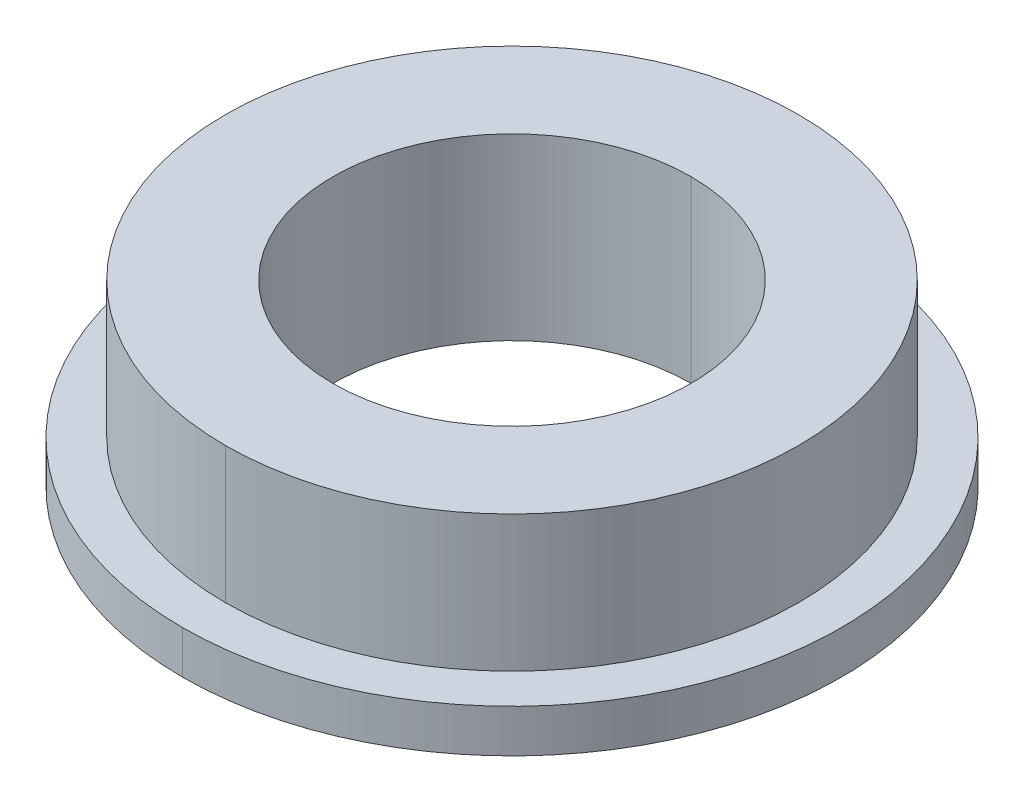
ISO-10303-21;
HEADER;
FILE_DESCRIPTION(('STEP AP214'),'2;1');
FILE_NAME('part.step','',(''),(''),'','','');
FILE_SCHEMA(('AUTOMOTIVE_DESIGN { 1 0 10303 214 1 1 1 1 }'));
ENDSEC;
DATA;
#1=APPLICATION_CONTEXT('core data for automotive mechanical design processes');
#2=APPLICATION_PROTOCOL_DEFINITION('international standard','automotive_design',2000,#1);
#3=PRODUCT_CONTEXT('',#1,'mechanical');
#4=PRODUCT('Part','Part','',(#3));
#5=PRODUCT_RELATED_PRODUCT_CATEGORY('part','',(#4));
#6=PRODUCT_DEFINITION_FORMATION('','',#4);
#7=PRODUCT_DEFINITION_CONTEXT('part definition',#1,'design');
#8=PRODUCT_DEFINITION('design','',#6,#7);
#9=PRODUCT_DEFINITION_SHAPE('','',#8);
#10=(LENGTH_UNIT() NAMED_UNIT(*) SI_UNIT(.MILLI.,.METRE.));
#11=(NAMED_UNIT(*) PLANE_ANGLE_UNIT() SI_UNIT($,.RADIAN.));
#12=(NAMED_UNIT(*) SI_UNIT($,.STERADIAN.) SOLID_ANGLE_UNIT());
#13=UNCERTAINTY_MEASURE_WITH_UNIT(LENGTH_MEASURE(1.E-05),#10,'distance_accuracy_value','');
#14=(GEOMETRIC_REPRESENTATION_CONTEXT(3) GLOBAL_UNCERTAINTY_ASSIGNED_CONTEXT((#13)) GLOBAL_UNIT_ASSIGNED_CONTEXT((#10,
#11,#12)) REPRESENTATION_CONTEXT('',''));
#15=CARTESIAN_POINT('',(0.,0.,0.));
#16=DIRECTION('',(0.,0.,1.));
#17=DIRECTION('',(1.,0.,0.));
#18=AXIS2_PLACEMENT_3D('',#15,#16,#17);
#19=CARTESIAN_POINT('',(0.,0.6,0.));
#20=DIRECTION('',(0.,-1.,0.));
#21=DIRECTION('',(0.,0.,-1.));
#22=AXIS2_PLACEMENT_3D('',#19,#20,#21);
#23=CYLINDRICAL_SURFACE('',#22,4.6);
#24=DIRECTION('',(0.,-1.,0.));
#25=VECTOR('',#24,1.);
#26=CARTESIAN_POINT('',(0.,0.6,4.6));
#27=LINE('',#26,#25);
#28=CARTESIAN_POINT('',(0.,0.6,4.6));
#29=VERTEX_POINT('',#28);
#30=CARTESIAN_POINT('',(0.,0.,4.6));
#31=VERTEX_POINT('',#30);
#32=EDGE_CURVE('E99',#29,#31,#27,.T.);
#33=ORIENTED_EDGE('',*,*,#32,.F.);
#34=CARTESIAN_POINT('',(0.,0.6,0.));
#35=DIRECTION('',(0.,1.,0.));
#36=DIRECTION('',(0.,0.,1.));
#37=AXIS2_PLACEMENT_3D('',#34,#35,#36);
#38=CIRCLE('',#37,4.6);
#39=CARTESIAN_POINT('',(0.,0.6,-4.6));
#40=VERTEX_POINT('',#39);
#41=EDGE_CURVE('E11',#40,#29,#38,.T.);
#42=ORIENTED_EDGE('',*,*,#41,.F.);
#43=DIRECTION('',(0.,-1.,0.));
#44=VECTOR('',#43,1.);
#45=CARTESIAN_POINT('',(0.,0.6,-4.6));
#46=LINE('',#45,#44);
#47=CARTESIAN_POINT('',(0.,0.,-4.6));
#48=VERTEX_POINT('',#47);
#49=EDGE_CURVE('E96',#40,#48,#46,.T.);
#50=ORIENTED_EDGE('',*,*,#49,.T.);
#51=CARTESIAN_POINT('',(0.,0.,0.));
#52=DIRECTION('',(0.,1.,0.));
#53=DIRECTION('',(0.,0.,1.));
#54=AXIS2_PLACEMENT_3D('',#51,#52,#53);
#55=CIRCLE('',#54,4.6);
#56=EDGE_CURVE('E129',#48,#31,#55,.T.);
#57=ORIENTED_EDGE('',*,*,#56,.T.);
#58=EDGE_LOOP('',(#33,#42,#50,#57));
#59=FACE_BOUND('',#58,.T.);
#60=ADVANCED_FACE('F17',(#59),#23,.T.);
#61=CARTESIAN_POINT('',(0.,0.6,0.));
#62=DIRECTION('',(0.,1.,0.));
#63=DIRECTION('',(1.,0.,0.));
#64=AXIS2_PLACEMENT_3D('',#61,#62,#63);
#65=PLANE('',#64);
#66=CARTESIAN_POINT('',(0.,0.6,0.));
#67=DIRECTION('',(0.,1.,0.));
#68=DIRECTION('',(0.,0.,1.));
#69=AXIS2_PLACEMENT_3D('',#66,#67,#68);
#70=CIRCLE('',#69,4.);
#71=CARTESIAN_POINT('',(0.,0.6,-4.));
#72=VERTEX_POINT('',#71);
#73=CARTESIAN_POINT('',(0.,0.6,4.));
#74=VERTEX_POINT('',#73);
#75=EDGE_CURVE('E28',#72,#74,#70,.T.);
#76=ORIENTED_EDGE('',*,*,#75,.F.);
#77=CARTESIAN_POINT('',(0.,0.6,0.));
#78=DIRECTION('',(0.,1.,0.));
#79=DIRECTION('',(0.,0.,1.));
#80=AXIS2_PLACEMENT_3D('',#77,#78,#79);
#81=CIRCLE('',#80,4.);
#82=EDGE_CURVE('E122',#74,#72,#81,.T.);
#83=ORIENTED_EDGE('',*,*,#82,.F.);
#84=EDGE_LOOP('',(#76,#83));
#85=FACE_BOUND('',#84,.T.);
#86=ORIENTED_EDGE('',*,*,#41,.T.);
#87=CARTESIAN_POINT('',(0.,0.6,0.));
#88=DIRECTION('',(0.,1.,0.));
#89=DIRECTION('',(0.,0.,1.));
#90=AXIS2_PLACEMENT_3D('',#87,#88,#89);
#91=CIRCLE('',#90,4.6);
#92=EDGE_CURVE('E105',#29,#40,#91,.T.);
#93=ORIENTED_EDGE('',*,*,#92,.T.);
#94=EDGE_LOOP('',(#86,#93));
#95=FACE_BOUND('',#94,.T.);
#96=ADVANCED_FACE('F111',(#85,#95),#65,.T.);
#97=CARTESIAN_POINT('',(0.,2.5,0.));
#98=DIRECTION('',(0.,-1.,0.));
#99=DIRECTION('',(0.,0.,-1.));
#100=AXIS2_PLACEMENT_3D('',#97,#98,#99);
#101=CYLINDRICAL_SURFACE('',#100,2.5);
#102=DIRECTION('',(0.,-1.,0.));
#103=VECTOR('',#102,1.);
#104=CARTESIAN_POINT('',(0.,2.5,2.5));
#105=LINE('',#104,#103);
#106=CARTESIAN_POINT('',(0.,2.5,2.5));
#107=VERTEX_POINT('',#106);
#108=CARTESIAN_POINT('',(0.,0.,2.5));
#109=VERTEX_POINT('',#108);
#110=EDGE_CURVE('E21',#107,#109,#105,.T.);
#111=ORIENTED_EDGE('',*,*,#110,.F.);
#112=CARTESIAN_POINT('',(0.,2.5,0.));
#113=DIRECTION('',(0.,1.,0.));
#114=DIRECTION('',(0.,0.,1.));
#115=AXIS2_PLACEMENT_3D('',#112,#113,#114);
#116=CIRCLE('',#115,2.5);
#117=CARTESIAN_POINT('',(0.,2.5,-2.5));
#118=VERTEX_POINT('',#117);
#119=EDGE_CURVE('E72',#107,#118,#116,.T.);
#120=ORIENTED_EDGE('',*,*,#119,.T.);
#121=DIRECTION('',(0.,-1.,0.));
#122=VECTOR('',#121,1.);
#123=CARTESIAN_POINT('',(0.,2.5,-2.5));
#124=LINE('',#123,#122);
#125=CARTESIAN_POINT('',(0.,0.,-2.5));
#126=VERTEX_POINT('',#125);
#127=EDGE_CURVE('E141',#118,#126,#124,.T.);
#128=ORIENTED_EDGE('',*,*,#127,.T.);
#129=CARTESIAN_POINT('',(0.,0.,0.));
#130=DIRECTION('',(0.,1.,0.));
#131=DIRECTION('',(0.,0.,1.));
#132=AXIS2_PLACEMENT_3D('',#129,#130,#131);
#133=CIRCLE('',#132,2.5);
#134=EDGE_CURVE('E85',#109,#126,#133,.T.);
#135=ORIENTED_EDGE('',*,*,#134,.F.);
#136=EDGE_LOOP('',(#111,#120,#128,#135));
#137=FACE_BOUND('',#136,.T.);
#138=ADVANCED_FACE('F169',(#137),#101,.F.);
#139=CARTESIAN_POINT('',(0.,2.5,0.));
#140=DIRECTION('',(0.,-1.,0.));
#141=DIRECTION('',(0.,0.,-1.));
#142=AXIS2_PLACEMENT_3D('',#139,#140,#141);
#143=CYLINDRICAL_SURFACE('',#142,4.);
#144=DIRECTION('',(0.,-1.,0.));
#145=VECTOR('',#144,1.);
#146=CARTESIAN_POINT('',(0.,2.5,4.));
#147=LINE('',#146,#145);
#148=CARTESIAN_POINT('',(0.,2.5,4.));
#149=VERTEX_POINT('',#148);
#150=EDGE_CURVE('E121',#149,#74,#147,.T.);
#151=ORIENTED_EDGE('',*,*,#150,.F.);
#152=CARTESIAN_POINT('',(0.,2.5,0.));
#153=DIRECTION('',(0.,1.,0.));
#154=DIRECTION('',(0.,0.,1.));
#155=AXIS2_PLACEMENT_3D('',#152,#153,#154);
#156=CIRCLE('',#155,4.);
#157=CARTESIAN_POINT('',(0.,2.5,-4.));
#158=VERTEX_POINT('',#157);
#159=EDGE_CURVE('E130',#158,#149,#156,.T.);
#160=ORIENTED_EDGE('',*,*,#159,.F.);
#161=DIRECTION('',(0.,-1.,0.));
#162=VECTOR('',#161,1.);
#163=CARTESIAN_POINT('',(0.,2.5,-4.));
#164=LINE('',#163,#162);
#165=EDGE_CURVE('E126',#158,#72,#164,.T.);
#166=ORIENTED_EDGE('',*,*,#165,.T.);
#167=ORIENTED_EDGE('',*,*,#75,.T.);
#168=EDGE_LOOP('',(#151,#160,#166,#167));
#169=FACE_BOUND('',#168,.T.);
#170=ADVANCED_FACE('F160',(#169),#143,.T.);
#171=CARTESIAN_POINT('',(0.,0.,0.));
#172=DIRECTION('',(0.,1.,0.));
#173=DIRECTION('',(1.,0.,0.));
#174=AXIS2_PLACEMENT_3D('',#171,#172,#173);
#175=PLANE('',#174);
#176=CARTESIAN_POINT('',(0.,0.,0.));
#177=DIRECTION('',(0.,1.,0.));
#178=DIRECTION('',(0.,0.,1.));
#179=AXIS2_PLACEMENT_3D('',#176,#177,#178);
#180=CIRCLE('',#179,2.5);
#181=EDGE_CURVE('E138',#126,#109,#180,.T.);
#182=ORIENTED_EDGE('',*,*,#181,.T.);
#183=ORIENTED_EDGE('',*,*,#134,.T.);
#184=EDGE_LOOP('',(#182,#183));
#185=FACE_BOUND('',#184,.T.);
#186=ORIENTED_EDGE('',*,*,#56,.F.);
#187=CARTESIAN_POINT('',(0.,0.,0.));
#188=DIRECTION('',(0.,1.,0.));
#189=DIRECTION('',(0.,0.,1.));
#190=AXIS2_PLACEMENT_3D('',#187,#188,#189);
#191=CIRCLE('',#190,4.6);
#192=EDGE_CURVE('E107',#31,#48,#191,.T.);
#193=ORIENTED_EDGE('',*,*,#192,.F.);
#194=EDGE_LOOP('',(#186,#193));
#195=FACE_BOUND('',#194,.T.);
#196=ADVANCED_FACE('F19',(#185,#195),#175,.F.);
#197=CARTESIAN_POINT('',(0.,2.5,0.));
#198=DIRECTION('',(0.,1.,0.));
#199=DIRECTION('',(1.,0.,0.));
#200=AXIS2_PLACEMENT_3D('',#197,#198,#199);
#201=PLANE('',#200);
#202=CARTESIAN_POINT('',(0.,2.5,0.));
#203=DIRECTION('',(0.,1.,0.));
#204=DIRECTION('',(0.,0.,1.));
#205=AXIS2_PLACEMENT_3D('',#202,#203,#204);
#206=CIRCLE('',#205,2.5);
#207=EDGE_CURVE('E109',#118,#107,#206,.T.);
#208=ORIENTED_EDGE('',*,*,#207,.F.);
#209=ORIENTED_EDGE('',*,*,#119,.F.);
#210=EDGE_LOOP('',(#208,#209));
#211=FACE_BOUND('',#210,.T.);
#212=ORIENTED_EDGE('',*,*,#159,.T.);
#213=CARTESIAN_POINT('',(0.,2.5,0.));
#214=DIRECTION('',(0.,1.,0.));
#215=DIRECTION('',(0.,0.,1.));
#216=AXIS2_PLACEMENT_3D('',#213,#214,#215);
#217=CIRCLE('',#216,4.);
#218=EDGE_CURVE('E144',#149,#158,#217,.T.);
#219=ORIENTED_EDGE('',*,*,#218,.T.);
#220=EDGE_LOOP('',(#212,#219));
#221=FACE_BOUND('',#220,.T.);
#222=ADVANCED_FACE('F159',(#211,#221),#201,.T.);
#223=CARTESIAN_POINT('',(0.,2.5,0.));
#224=DIRECTION('',(0.,-1.,0.));
#225=DIRECTION('',(0.,0.,-1.));
#226=AXIS2_PLACEMENT_3D('',#223,#224,#225);
#227=CYLINDRICAL_SURFACE('',#226,4.);
#228=ORIENTED_EDGE('',*,*,#218,.F.);
#229=ORIENTED_EDGE('',*,*,#150,.T.);
#230=ORIENTED_EDGE('',*,*,#82,.T.);
#231=ORIENTED_EDGE('',*,*,#165,.F.);
#232=EDGE_LOOP('',(#228,#229,#230,#231));
#233=FACE_BOUND('',#232,.T.);
#234=ADVANCED_FACE('F167',(#233),#227,.T.);
#235=CARTESIAN_POINT('',(0.,2.5,0.));
#236=DIRECTION('',(0.,-1.,0.));
#237=DIRECTION('',(0.,0.,-1.));
#238=AXIS2_PLACEMENT_3D('',#235,#236,#237);
#239=CYLINDRICAL_SURFACE('',#238,2.5);
#240=ORIENTED_EDGE('',*,*,#207,.T.);
#241=ORIENTED_EDGE('',*,*,#110,.T.);
#242=ORIENTED_EDGE('',*,*,#181,.F.);
#243=ORIENTED_EDGE('',*,*,#127,.F.);
#244=EDGE_LOOP('',(#240,#241,#242,#243));
#245=FACE_BOUND('',#244,.T.);
#246=ADVANCED_FACE('F180',(#245),#239,.F.);
#247=CARTESIAN_POINT('',(0.,0.6,0.));
#248=DIRECTION('',(0.,-1.,0.));
#249=DIRECTION('',(0.,0.,-1.));
#250=AXIS2_PLACEMENT_3D('',#247,#248,#249);
#251=CYLINDRICAL_SURFACE('',#250,4.6);
#252=ORIENTED_EDGE('',*,*,#92,.F.);
#253=ORIENTED_EDGE('',*,*,#32,.T.);
#254=ORIENTED_EDGE('',*,*,#192,.T.);
#255=ORIENTED_EDGE('',*,*,#49,.F.);
#256=EDGE_LOOP('',(#252,#253,#254,#255));
#257=FACE_BOUND('',#256,.T.);
#258=ADVANCED_FACE('F104',(#257),#251,.T.);
#259=CLOSED_SHELL('',(#60,#96,#138,#170,#196,#222,#234,#246,#258));
#260=MANIFOLD_SOLID_BREP('B1',#259);
#261=ADVANCED_BREP_SHAPE_REPRESENTATION('',(#18,#260),#14);
#262=SHAPE_DEFINITION_REPRESENTATION(#9,#261);
ENDSEC;
END-ISO-10303-21;
